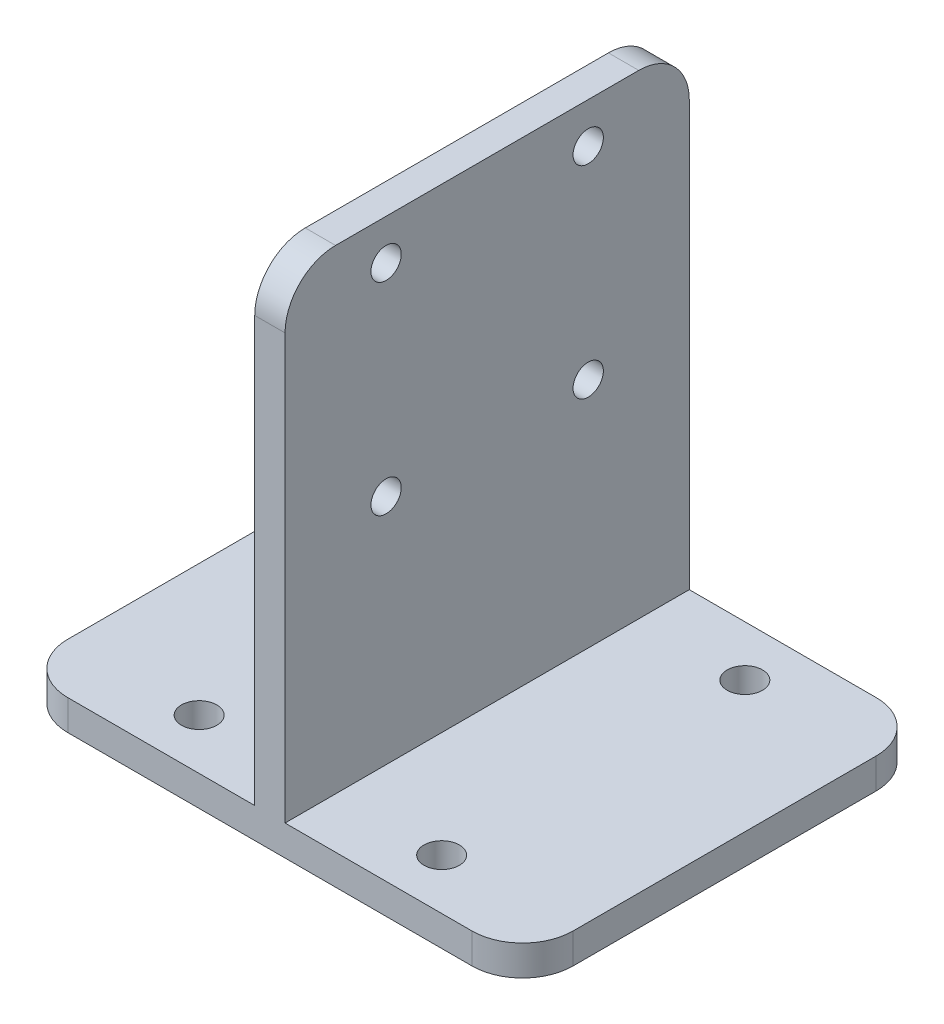
ISO-10303-21;
HEADER;
FILE_DESCRIPTION(('STEP AP214'),'2;1');
FILE_NAME('part.step','',(''),(''),'','','');
FILE_SCHEMA(('AUTOMOTIVE_DESIGN { 1 0 10303 214 1 1 1 1 }'));
ENDSEC;
DATA;
#1=APPLICATION_CONTEXT('core data for automotive mechanical design processes');
#2=APPLICATION_PROTOCOL_DEFINITION('international standard','automotive_design',2000,#1);
#3=PRODUCT_CONTEXT('',#1,'mechanical');
#4=PRODUCT('Part','Part','',(#3));
#5=PRODUCT_RELATED_PRODUCT_CATEGORY('part','',(#4));
#6=PRODUCT_DEFINITION_FORMATION('','',#4);
#7=PRODUCT_DEFINITION_CONTEXT('part definition',#1,'design');
#8=PRODUCT_DEFINITION('design','',#6,#7);
#9=PRODUCT_DEFINITION_SHAPE('','',#8);
#10=(LENGTH_UNIT() NAMED_UNIT(*) SI_UNIT(.MILLI.,.METRE.));
#11=(NAMED_UNIT(*) PLANE_ANGLE_UNIT() SI_UNIT($,.RADIAN.));
#12=(NAMED_UNIT(*) SI_UNIT($,.STERADIAN.) SOLID_ANGLE_UNIT());
#13=UNCERTAINTY_MEASURE_WITH_UNIT(LENGTH_MEASURE(1.E-05),#10,'distance_accuracy_value','');
#14=(GEOMETRIC_REPRESENTATION_CONTEXT(3) GLOBAL_UNCERTAINTY_ASSIGNED_CONTEXT((#13)) GLOBAL_UNIT_ASSIGNED_CONTEXT((#10,
#11,#12)) REPRESENTATION_CONTEXT('',''));
#15=CARTESIAN_POINT('',(0.,0.,0.));
#16=DIRECTION('',(0.,0.,1.));
#17=DIRECTION('',(1.,0.,0.));
#18=AXIS2_PLACEMENT_3D('',#15,#16,#17);
#19=CARTESIAN_POINT('',(0.,3.,0.));
#20=DIRECTION('',(0.,-1.,0.));
#21=DIRECTION('',(0.,0.,-1.));
#22=AXIS2_PLACEMENT_3D('',#19,#20,#21);
#23=PLANE('',#22);
#24=CARTESIAN_POINT('',(12.,3.,15.));
#25=DIRECTION('',(0.,1.,0.));
#26=DIRECTION('',(0.,0.,1.));
#27=AXIS2_PLACEMENT_3D('',#24,#25,#26);
#28=CIRCLE('',#27,1.75);
#29=CARTESIAN_POINT('',(12.,3.,16.75));
#30=VERTEX_POINT('',#29);
#31=EDGE_CURVE('E183',#30,#30,#28,.T.);
#32=ORIENTED_EDGE('',*,*,#31,.F.);
#33=EDGE_LOOP('',(#32));
#34=FACE_BOUND('',#33,.T.);
#35=CARTESIAN_POINT('',(12.,3.,-15.));
#36=DIRECTION('',(0.,1.,0.));
#37=DIRECTION('',(0.,0.,1.));
#38=AXIS2_PLACEMENT_3D('',#35,#36,#37);
#39=CIRCLE('',#38,1.75);
#40=CARTESIAN_POINT('',(12.,3.,-13.25));
#41=VERTEX_POINT('',#40);
#42=EDGE_CURVE('E189',#41,#41,#39,.T.);
#43=ORIENTED_EDGE('',*,*,#42,.F.);
#44=EDGE_LOOP('',(#43));
#45=FACE_BOUND('',#44,.T.);
#46=DIRECTION('',(0.,0.,-1.));
#47=VECTOR('',#46,1.);
#48=CARTESIAN_POINT('',(1.5,3.,20.));
#49=LINE('',#48,#47);
#50=CARTESIAN_POINT('',(1.5,3.,20.));
#51=VERTEX_POINT('',#50);
#52=CARTESIAN_POINT('',(1.5,3.,-20.));
#53=VERTEX_POINT('',#52);
#54=EDGE_CURVE('E162',#51,#53,#49,.T.);
#55=ORIENTED_EDGE('',*,*,#54,.F.);
#56=DIRECTION('',(1.,0.,0.));
#57=VECTOR('',#56,1.);
#58=CARTESIAN_POINT('',(-25.,3.,20.));
#59=LINE('',#58,#57);
#60=CARTESIAN_POINT('',(20.,3.,20.));
#61=VERTEX_POINT('',#60);
#62=EDGE_CURVE('E158',#51,#61,#59,.T.);
#63=ORIENTED_EDGE('',*,*,#62,.T.);
#64=CARTESIAN_POINT('',(20.,3.,15.));
#65=DIRECTION('',(0.,-1.,0.));
#66=DIRECTION('',(0.,0.,-1.));
#67=AXIS2_PLACEMENT_3D('',#64,#65,#66);
#68=CIRCLE('',#67,5.);
#69=CARTESIAN_POINT('',(25.,3.,15.));
#70=VERTEX_POINT('',#69);
#71=EDGE_CURVE('E240',#61,#70,#68,.F.);
#72=ORIENTED_EDGE('',*,*,#71,.T.);
#73=DIRECTION('',(0.,0.,-1.));
#74=VECTOR('',#73,1.);
#75=CARTESIAN_POINT('',(25.,3.,20.));
#76=LINE('',#75,#74);
#77=CARTESIAN_POINT('',(25.,3.,-15.));
#78=VERTEX_POINT('',#77);
#79=EDGE_CURVE('E201',#70,#78,#76,.T.);
#80=ORIENTED_EDGE('',*,*,#79,.T.);
#81=CARTESIAN_POINT('',(20.,3.,-15.));
#82=DIRECTION('',(0.,-1.,0.));
#83=DIRECTION('',(0.,0.,-1.));
#84=AXIS2_PLACEMENT_3D('',#81,#82,#83);
#85=CIRCLE('',#84,5.);
#86=CARTESIAN_POINT('',(20.,3.,-20.));
#87=VERTEX_POINT('',#86);
#88=EDGE_CURVE('E242',#78,#87,#85,.F.);
#89=ORIENTED_EDGE('',*,*,#88,.T.);
#90=DIRECTION('',(-1.,0.,0.));
#91=VECTOR('',#90,1.);
#92=CARTESIAN_POINT('',(-25.,3.,-20.));
#93=LINE('',#92,#91);
#94=EDGE_CURVE('E206',#87,#53,#93,.T.);
#95=ORIENTED_EDGE('',*,*,#94,.T.);
#96=EDGE_LOOP('',(#55,#63,#72,#80,#89,#95));
#97=FACE_BOUND('',#96,.T.);
#98=ADVANCED_FACE('F39',(#34,#45,#97),#23,.F.);
#99=CARTESIAN_POINT('',(-12.,3.,15.));
#100=DIRECTION('',(0.,1.,0.));
#101=DIRECTION('',(0.,0.,1.));
#102=AXIS2_PLACEMENT_3D('',#99,#100,#101);
#103=CIRCLE('',#102,1.75);
#104=CARTESIAN_POINT('',(-12.,3.,16.75));
#105=VERTEX_POINT('',#104);
#106=EDGE_CURVE('E177',#105,#105,#103,.T.);
#107=ORIENTED_EDGE('',*,*,#106,.F.);
#108=EDGE_LOOP('',(#107));
#109=FACE_BOUND('',#108,.T.);
#110=CARTESIAN_POINT('',(-12.,3.,-15.));
#111=DIRECTION('',(0.,1.,0.));
#112=DIRECTION('',(0.,0.,1.));
#113=AXIS2_PLACEMENT_3D('',#110,#111,#112);
#114=CIRCLE('',#113,1.75);
#115=CARTESIAN_POINT('',(-12.,3.,-13.25));
#116=VERTEX_POINT('',#115);
#117=EDGE_CURVE('E195',#116,#116,#114,.T.);
#118=ORIENTED_EDGE('',*,*,#117,.F.);
#119=EDGE_LOOP('',(#118));
#120=FACE_BOUND('',#119,.T.);
#121=DIRECTION('',(0.,0.,1.));
#122=VECTOR('',#121,1.);
#123=CARTESIAN_POINT('',(-1.5,3.,20.));
#124=LINE('',#123,#122);
#125=CARTESIAN_POINT('',(-1.5,3.,-20.));
#126=VERTEX_POINT('',#125);
#127=CARTESIAN_POINT('',(-1.5,3.,20.));
#128=VERTEX_POINT('',#127);
#129=EDGE_CURVE('E152',#126,#128,#124,.T.);
#130=ORIENTED_EDGE('',*,*,#129,.F.);
#131=CARTESIAN_POINT('',(-20.,3.,-20.));
#132=VERTEX_POINT('',#131);
#133=EDGE_CURVE('E204',#126,#132,#93,.T.);
#134=ORIENTED_EDGE('',*,*,#133,.T.);
#135=CARTESIAN_POINT('',(-20.,3.,-15.));
#136=DIRECTION('',(0.,-1.,0.));
#137=DIRECTION('',(0.,0.,-1.));
#138=AXIS2_PLACEMENT_3D('',#135,#136,#137);
#139=CIRCLE('',#138,5.);
#140=CARTESIAN_POINT('',(-25.,3.,-15.));
#141=VERTEX_POINT('',#140);
#142=EDGE_CURVE('E244',#132,#141,#139,.F.);
#143=ORIENTED_EDGE('',*,*,#142,.T.);
#144=DIRECTION('',(0.,0.,1.));
#145=VECTOR('',#144,1.);
#146=CARTESIAN_POINT('',(-25.,3.,20.));
#147=LINE('',#146,#145);
#148=CARTESIAN_POINT('',(-25.,3.,15.));
#149=VERTEX_POINT('',#148);
#150=EDGE_CURVE('E209',#141,#149,#147,.T.);
#151=ORIENTED_EDGE('',*,*,#150,.T.);
#152=CARTESIAN_POINT('',(-20.,3.,15.));
#153=DIRECTION('',(0.,-1.,0.));
#154=DIRECTION('',(0.,0.,-1.));
#155=AXIS2_PLACEMENT_3D('',#152,#153,#154);
#156=CIRCLE('',#155,5.);
#157=CARTESIAN_POINT('',(-20.,3.,20.));
#158=VERTEX_POINT('',#157);
#159=EDGE_CURVE('E156',#149,#158,#156,.F.);
#160=ORIENTED_EDGE('',*,*,#159,.T.);
#161=EDGE_CURVE('E142',#158,#128,#59,.T.);
#162=ORIENTED_EDGE('',*,*,#161,.T.);
#163=EDGE_LOOP('',(#130,#134,#143,#151,#160,#162));
#164=FACE_BOUND('',#163,.T.);
#165=ADVANCED_FACE('F151',(#109,#120,#164),#23,.F.);
#166=CARTESIAN_POINT('',(0.,0.,0.));
#167=DIRECTION('',(0.,-1.,0.));
#168=DIRECTION('',(0.,0.,-1.));
#169=AXIS2_PLACEMENT_3D('',#166,#167,#168);
#170=PLANE('',#169);
#171=CARTESIAN_POINT('',(12.,0.,15.));
#172=DIRECTION('',(0.,1.,0.));
#173=DIRECTION('',(0.,0.,1.));
#174=AXIS2_PLACEMENT_3D('',#171,#172,#173);
#175=CIRCLE('',#174,1.75);
#176=CARTESIAN_POINT('',(12.,0.,16.75));
#177=VERTEX_POINT('',#176);
#178=EDGE_CURVE('E180',#177,#177,#175,.T.);
#179=ORIENTED_EDGE('',*,*,#178,.T.);
#180=EDGE_LOOP('',(#179));
#181=FACE_BOUND('',#180,.T.);
#182=CARTESIAN_POINT('',(-12.,0.,-15.));
#183=DIRECTION('',(0.,1.,0.));
#184=DIRECTION('',(0.,0.,1.));
#185=AXIS2_PLACEMENT_3D('',#182,#183,#184);
#186=CIRCLE('',#185,1.75);
#187=CARTESIAN_POINT('',(-12.,0.,-13.25));
#188=VERTEX_POINT('',#187);
#189=EDGE_CURVE('E192',#188,#188,#186,.T.);
#190=ORIENTED_EDGE('',*,*,#189,.T.);
#191=EDGE_LOOP('',(#190));
#192=FACE_BOUND('',#191,.T.);
#193=DIRECTION('',(0.,0.,1.));
#194=VECTOR('',#193,1.);
#195=CARTESIAN_POINT('',(-25.,0.,20.));
#196=LINE('',#195,#194);
#197=CARTESIAN_POINT('',(-25.,0.,-15.));
#198=VERTEX_POINT('',#197);
#199=CARTESIAN_POINT('',(-25.,0.,15.));
#200=VERTEX_POINT('',#199);
#201=EDGE_CURVE('E216',#198,#200,#196,.T.);
#202=ORIENTED_EDGE('',*,*,#201,.F.);
#203=CARTESIAN_POINT('',(-20.,0.,-15.));
#204=DIRECTION('',(0.,-1.,0.));
#205=DIRECTION('',(0.,0.,-1.));
#206=AXIS2_PLACEMENT_3D('',#203,#204,#205);
#207=CIRCLE('',#206,5.);
#208=CARTESIAN_POINT('',(-20.,0.,-20.));
#209=VERTEX_POINT('',#208);
#210=EDGE_CURVE('E231',#198,#209,#207,.T.);
#211=ORIENTED_EDGE('',*,*,#210,.T.);
#212=DIRECTION('',(-1.,0.,0.));
#213=VECTOR('',#212,1.);
#214=CARTESIAN_POINT('',(-25.,0.,-20.));
#215=LINE('',#214,#213);
#216=CARTESIAN_POINT('',(20.,0.,-20.));
#217=VERTEX_POINT('',#216);
#218=EDGE_CURVE('E213',#217,#209,#215,.T.);
#219=ORIENTED_EDGE('',*,*,#218,.F.);
#220=CARTESIAN_POINT('',(20.,0.,-15.));
#221=DIRECTION('',(0.,-1.,0.));
#222=DIRECTION('',(0.,0.,-1.));
#223=AXIS2_PLACEMENT_3D('',#220,#221,#222);
#224=CIRCLE('',#223,5.);
#225=CARTESIAN_POINT('',(25.,0.,-15.));
#226=VERTEX_POINT('',#225);
#227=EDGE_CURVE('E229',#217,#226,#224,.T.);
#228=ORIENTED_EDGE('',*,*,#227,.T.);
#229=DIRECTION('',(0.,0.,-1.));
#230=VECTOR('',#229,1.);
#231=CARTESIAN_POINT('',(25.,0.,20.));
#232=LINE('',#231,#230);
#233=CARTESIAN_POINT('',(25.,0.,15.));
#234=VERTEX_POINT('',#233);
#235=EDGE_CURVE('E198',#234,#226,#232,.T.);
#236=ORIENTED_EDGE('',*,*,#235,.F.);
#237=CARTESIAN_POINT('',(20.,0.,15.));
#238=DIRECTION('',(0.,-1.,0.));
#239=DIRECTION('',(0.,0.,-1.));
#240=AXIS2_PLACEMENT_3D('',#237,#238,#239);
#241=CIRCLE('',#240,5.);
#242=CARTESIAN_POINT('',(20.,0.,20.));
#243=VERTEX_POINT('',#242);
#244=EDGE_CURVE('E227',#234,#243,#241,.T.);
#245=ORIENTED_EDGE('',*,*,#244,.T.);
#246=DIRECTION('',(1.,0.,0.));
#247=VECTOR('',#246,1.);
#248=CARTESIAN_POINT('',(-25.,0.,20.));
#249=LINE('',#248,#247);
#250=CARTESIAN_POINT('',(-20.,0.,20.));
#251=VERTEX_POINT('',#250);
#252=EDGE_CURVE('E205',#251,#243,#249,.T.);
#253=ORIENTED_EDGE('',*,*,#252,.F.);
#254=CARTESIAN_POINT('',(-20.,0.,15.));
#255=DIRECTION('',(0.,-1.,0.));
#256=DIRECTION('',(0.,0.,-1.));
#257=AXIS2_PLACEMENT_3D('',#254,#255,#256);
#258=CIRCLE('',#257,5.);
#259=EDGE_CURVE('E225',#251,#200,#258,.T.);
#260=ORIENTED_EDGE('',*,*,#259,.T.);
#261=EDGE_LOOP('',(#202,#211,#219,#228,#236,#245,#253,#260));
#262=FACE_BOUND('',#261,.T.);
#263=CARTESIAN_POINT('',(12.,0.,-15.));
#264=DIRECTION('',(0.,1.,0.));
#265=DIRECTION('',(0.,0.,1.));
#266=AXIS2_PLACEMENT_3D('',#263,#264,#265);
#267=CIRCLE('',#266,1.75);
#268=CARTESIAN_POINT('',(12.,0.,-13.25));
#269=VERTEX_POINT('',#268);
#270=EDGE_CURVE('E186',#269,#269,#267,.T.);
#271=ORIENTED_EDGE('',*,*,#270,.T.);
#272=EDGE_LOOP('',(#271));
#273=FACE_BOUND('',#272,.T.);
#274=CARTESIAN_POINT('',(-12.,0.,15.));
#275=DIRECTION('',(0.,1.,0.));
#276=DIRECTION('',(0.,0.,1.));
#277=AXIS2_PLACEMENT_3D('',#274,#275,#276);
#278=CIRCLE('',#277,1.75);
#279=CARTESIAN_POINT('',(-12.,0.,16.75));
#280=VERTEX_POINT('',#279);
#281=EDGE_CURVE('E176',#280,#280,#278,.T.);
#282=ORIENTED_EDGE('',*,*,#281,.T.);
#283=EDGE_LOOP('',(#282));
#284=FACE_BOUND('',#283,.T.);
#285=ADVANCED_FACE('F302',(#181,#192,#262,#273,#284),#170,.T.);
#286=CARTESIAN_POINT('',(25.,3.,20.));
#287=DIRECTION('',(-1.,0.,0.));
#288=DIRECTION('',(0.,0.,1.));
#289=AXIS2_PLACEMENT_3D('',#286,#287,#288);
#290=PLANE('',#289);
#291=ORIENTED_EDGE('',*,*,#235,.T.);
#292=DIRECTION('',(0.,-1.,0.));
#293=VECTOR('',#292,1.);
#294=CARTESIAN_POINT('',(25.,3.,-15.));
#295=LINE('',#294,#293);
#296=EDGE_CURVE('E249',#226,#78,#295,.F.);
#297=ORIENTED_EDGE('',*,*,#296,.T.);
#298=ORIENTED_EDGE('',*,*,#79,.F.);
#299=DIRECTION('',(0.,-1.,0.));
#300=VECTOR('',#299,1.);
#301=CARTESIAN_POINT('',(25.,3.,15.));
#302=LINE('',#301,#300);
#303=EDGE_CURVE('E246',#70,#234,#302,.T.);
#304=ORIENTED_EDGE('',*,*,#303,.T.);
#305=EDGE_LOOP('',(#291,#297,#298,#304));
#306=FACE_BOUND('',#305,.T.);
#307=ADVANCED_FACE('F311',(#306),#290,.F.);
#308=CARTESIAN_POINT('',(-25.,3.,-20.));
#309=DIRECTION('',(0.,0.,1.));
#310=DIRECTION('',(1.,0.,0.));
#311=AXIS2_PLACEMENT_3D('',#308,#309,#310);
#312=PLANE('',#311);
#313=DIRECTION('',(0.,-1.,0.));
#314=VECTOR('',#313,1.);
#315=CARTESIAN_POINT('',(-1.5,50.,-20.));
#316=LINE('',#315,#314);
#317=CARTESIAN_POINT('',(-1.5,45.,-20.));
#318=VERTEX_POINT('',#317);
#319=EDGE_CURVE('E146',#318,#126,#316,.T.);
#320=ORIENTED_EDGE('',*,*,#319,.F.);
#321=DIRECTION('',(-1.,0.,0.));
#322=VECTOR('',#321,1.);
#323=CARTESIAN_POINT('',(-25.,45.,-20.));
#324=LINE('',#323,#322);
#325=CARTESIAN_POINT('',(1.5,45.,-20.));
#326=VERTEX_POINT('',#325);
#327=EDGE_CURVE('E11',#318,#326,#324,.F.);
#328=ORIENTED_EDGE('',*,*,#327,.T.);
#329=DIRECTION('',(0.,-1.,0.));
#330=VECTOR('',#329,1.);
#331=CARTESIAN_POINT('',(1.5,50.,-20.));
#332=LINE('',#331,#330);
#333=EDGE_CURVE('E174',#326,#53,#332,.T.);
#334=ORIENTED_EDGE('',*,*,#333,.T.);
#335=ORIENTED_EDGE('',*,*,#94,.F.);
#336=DIRECTION('',(0.,-1.,0.));
#337=VECTOR('',#336,1.);
#338=CARTESIAN_POINT('',(20.,3.,-20.));
#339=LINE('',#338,#337);
#340=EDGE_CURVE('E233',#87,#217,#339,.T.);
#341=ORIENTED_EDGE('',*,*,#340,.T.);
#342=ORIENTED_EDGE('',*,*,#218,.T.);
#343=DIRECTION('',(0.,-1.,0.));
#344=VECTOR('',#343,1.);
#345=CARTESIAN_POINT('',(-20.,3.,-20.));
#346=LINE('',#345,#344);
#347=EDGE_CURVE('E236',#209,#132,#346,.F.);
#348=ORIENTED_EDGE('',*,*,#347,.T.);
#349=ORIENTED_EDGE('',*,*,#133,.F.);
#350=EDGE_LOOP('',(#320,#328,#334,#335,#341,#342,#348,#349));
#351=FACE_BOUND('',#350,.T.);
#352=ADVANCED_FACE('F289',(#351),#312,.F.);
#353=CARTESIAN_POINT('',(-25.,3.,20.));
#354=DIRECTION('',(1.,0.,0.));
#355=DIRECTION('',(0.,0.,-1.));
#356=AXIS2_PLACEMENT_3D('',#353,#354,#355);
#357=PLANE('',#356);
#358=ORIENTED_EDGE('',*,*,#150,.F.);
#359=DIRECTION('',(0.,-1.,0.));
#360=VECTOR('',#359,1.);
#361=CARTESIAN_POINT('',(-25.,3.,-15.));
#362=LINE('',#361,#360);
#363=EDGE_CURVE('E222',#141,#198,#362,.T.);
#364=ORIENTED_EDGE('',*,*,#363,.T.);
#365=ORIENTED_EDGE('',*,*,#201,.T.);
#366=DIRECTION('',(0.,-1.,0.));
#367=VECTOR('',#366,1.);
#368=CARTESIAN_POINT('',(-25.,3.,15.));
#369=LINE('',#368,#367);
#370=EDGE_CURVE('E157',#200,#149,#369,.F.);
#371=ORIENTED_EDGE('',*,*,#370,.T.);
#372=EDGE_LOOP('',(#358,#364,#365,#371));
#373=FACE_BOUND('',#372,.T.);
#374=ADVANCED_FACE('F296',(#373),#357,.F.);
#375=CARTESIAN_POINT('',(-25.,3.,20.));
#376=DIRECTION('',(0.,0.,-1.));
#377=DIRECTION('',(-1.,0.,0.));
#378=AXIS2_PLACEMENT_3D('',#375,#376,#377);
#379=PLANE('',#378);
#380=DIRECTION('',(0.,-1.,0.));
#381=VECTOR('',#380,1.);
#382=CARTESIAN_POINT('',(1.5,50.,20.));
#383=LINE('',#382,#381);
#384=CARTESIAN_POINT('',(1.5,45.,20.));
#385=VERTEX_POINT('',#384);
#386=EDGE_CURVE('E147',#385,#51,#383,.T.);
#387=ORIENTED_EDGE('',*,*,#386,.F.);
#388=DIRECTION('',(1.,0.,0.));
#389=VECTOR('',#388,1.);
#390=CARTESIAN_POINT('',(-25.,45.,20.));
#391=LINE('',#390,#389);
#392=CARTESIAN_POINT('',(-1.5,45.,20.));
#393=VERTEX_POINT('',#392);
#394=EDGE_CURVE('E62',#385,#393,#391,.F.);
#395=ORIENTED_EDGE('',*,*,#394,.T.);
#396=DIRECTION('',(0.,-1.,0.));
#397=VECTOR('',#396,1.);
#398=CARTESIAN_POINT('',(-1.5,50.,20.));
#399=LINE('',#398,#397);
#400=EDGE_CURVE('E138',#393,#128,#399,.T.);
#401=ORIENTED_EDGE('',*,*,#400,.T.);
#402=ORIENTED_EDGE('',*,*,#161,.F.);
#403=DIRECTION('',(0.,-1.,0.));
#404=VECTOR('',#403,1.);
#405=CARTESIAN_POINT('',(-20.,3.,20.));
#406=LINE('',#405,#404);
#407=EDGE_CURVE('E251',#158,#251,#406,.T.);
#408=ORIENTED_EDGE('',*,*,#407,.T.);
#409=ORIENTED_EDGE('',*,*,#252,.T.);
#410=DIRECTION('',(0.,-1.,0.));
#411=VECTOR('',#410,1.);
#412=CARTESIAN_POINT('',(20.,3.,20.));
#413=LINE('',#412,#411);
#414=EDGE_CURVE('E253',#243,#61,#413,.F.);
#415=ORIENTED_EDGE('',*,*,#414,.T.);
#416=ORIENTED_EDGE('',*,*,#62,.F.);
#417=EDGE_LOOP('',(#387,#395,#401,#402,#408,#409,#415,#416));
#418=FACE_BOUND('',#417,.T.);
#419=ADVANCED_FACE('F140',(#418),#379,.F.);
#420=CARTESIAN_POINT('',(-12.,3.,-15.));
#421=DIRECTION('',(0.,-1.,0.));
#422=DIRECTION('',(0.,0.,-1.));
#423=AXIS2_PLACEMENT_3D('',#420,#421,#422);
#424=CYLINDRICAL_SURFACE('',#423,1.75);
#425=ORIENTED_EDGE('',*,*,#117,.T.);
#426=EDGE_LOOP('',(#425));
#427=FACE_BOUND('',#426,.T.);
#428=ORIENTED_EDGE('',*,*,#189,.F.);
#429=EDGE_LOOP('',(#428));
#430=FACE_BOUND('',#429,.T.);
#431=ADVANCED_FACE('F338',(#427,#430),#424,.F.);
#432=CARTESIAN_POINT('',(12.,3.,-15.));
#433=DIRECTION('',(0.,-1.,0.));
#434=DIRECTION('',(0.,0.,-1.));
#435=AXIS2_PLACEMENT_3D('',#432,#433,#434);
#436=CYLINDRICAL_SURFACE('',#435,1.75);
#437=ORIENTED_EDGE('',*,*,#42,.T.);
#438=EDGE_LOOP('',(#437));
#439=FACE_BOUND('',#438,.T.);
#440=ORIENTED_EDGE('',*,*,#270,.F.);
#441=EDGE_LOOP('',(#440));
#442=FACE_BOUND('',#441,.T.);
#443=ADVANCED_FACE('F499',(#439,#442),#436,.F.);
#444=CARTESIAN_POINT('',(12.,3.,15.));
#445=DIRECTION('',(0.,-1.,0.));
#446=DIRECTION('',(0.,0.,-1.));
#447=AXIS2_PLACEMENT_3D('',#444,#445,#446);
#448=CYLINDRICAL_SURFACE('',#447,1.75);
#449=ORIENTED_EDGE('',*,*,#31,.T.);
#450=EDGE_LOOP('',(#449));
#451=FACE_BOUND('',#450,.T.);
#452=ORIENTED_EDGE('',*,*,#178,.F.);
#453=EDGE_LOOP('',(#452));
#454=FACE_BOUND('',#453,.T.);
#455=ADVANCED_FACE('F496',(#451,#454),#448,.F.);
#456=CARTESIAN_POINT('',(-12.,3.,15.));
#457=DIRECTION('',(0.,-1.,0.));
#458=DIRECTION('',(0.,0.,-1.));
#459=AXIS2_PLACEMENT_3D('',#456,#457,#458);
#460=CYLINDRICAL_SURFACE('',#459,1.75);
#461=ORIENTED_EDGE('',*,*,#106,.T.);
#462=EDGE_LOOP('',(#461));
#463=FACE_BOUND('',#462,.T.);
#464=ORIENTED_EDGE('',*,*,#281,.F.);
#465=EDGE_LOOP('',(#464));
#466=FACE_BOUND('',#465,.T.);
#467=ADVANCED_FACE('F353',(#463,#466),#460,.F.);
#468=CARTESIAN_POINT('',(-20.,3.,-15.));
#469=DIRECTION('',(0.,-1.,0.));
#470=DIRECTION('',(0.,0.,-1.));
#471=AXIS2_PLACEMENT_3D('',#468,#469,#470);
#472=CYLINDRICAL_SURFACE('',#471,5.);
#473=ORIENTED_EDGE('',*,*,#142,.F.);
#474=ORIENTED_EDGE('',*,*,#347,.F.);
#475=ORIENTED_EDGE('',*,*,#210,.F.);
#476=ORIENTED_EDGE('',*,*,#363,.F.);
#477=EDGE_LOOP('',(#473,#474,#475,#476));
#478=FACE_BOUND('',#477,.T.);
#479=ADVANCED_FACE('F299',(#478),#472,.T.);
#480=CARTESIAN_POINT('',(20.,3.,-15.));
#481=DIRECTION('',(0.,-1.,0.));
#482=DIRECTION('',(0.,0.,-1.));
#483=AXIS2_PLACEMENT_3D('',#480,#481,#482);
#484=CYLINDRICAL_SURFACE('',#483,5.);
#485=ORIENTED_EDGE('',*,*,#88,.F.);
#486=ORIENTED_EDGE('',*,*,#296,.F.);
#487=ORIENTED_EDGE('',*,*,#227,.F.);
#488=ORIENTED_EDGE('',*,*,#340,.F.);
#489=EDGE_LOOP('',(#485,#486,#487,#488));
#490=FACE_BOUND('',#489,.T.);
#491=ADVANCED_FACE('F307',(#490),#484,.T.);
#492=CARTESIAN_POINT('',(20.,3.,15.));
#493=DIRECTION('',(0.,-1.,0.));
#494=DIRECTION('',(0.,0.,-1.));
#495=AXIS2_PLACEMENT_3D('',#492,#493,#494);
#496=CYLINDRICAL_SURFACE('',#495,5.);
#497=ORIENTED_EDGE('',*,*,#71,.F.);
#498=ORIENTED_EDGE('',*,*,#414,.F.);
#499=ORIENTED_EDGE('',*,*,#244,.F.);
#500=ORIENTED_EDGE('',*,*,#303,.F.);
#501=EDGE_LOOP('',(#497,#498,#499,#500));
#502=FACE_BOUND('',#501,.T.);
#503=ADVANCED_FACE('F314',(#502),#496,.T.);
#504=CARTESIAN_POINT('',(-20.,3.,15.));
#505=DIRECTION('',(0.,-1.,0.));
#506=DIRECTION('',(0.,0.,-1.));
#507=AXIS2_PLACEMENT_3D('',#504,#505,#506);
#508=CYLINDRICAL_SURFACE('',#507,5.);
#509=ORIENTED_EDGE('',*,*,#159,.F.);
#510=ORIENTED_EDGE('',*,*,#370,.F.);
#511=ORIENTED_EDGE('',*,*,#259,.F.);
#512=ORIENTED_EDGE('',*,*,#407,.F.);
#513=EDGE_LOOP('',(#509,#510,#511,#512));
#514=FACE_BOUND('',#513,.T.);
#515=ADVANCED_FACE('F317',(#514),#508,.T.);
#516=CARTESIAN_POINT('',(1.5,50.,20.));
#517=DIRECTION('',(-1.,0.,0.));
#518=DIRECTION('',(0.,0.,1.));
#519=AXIS2_PLACEMENT_3D('',#516,#517,#518);
#520=PLANE('',#519);
#521=CARTESIAN_POINT('',(1.5,26.,-10.));
#522=DIRECTION('',(-1.,0.,0.));
#523=DIRECTION('',(0.,0.,1.));
#524=AXIS2_PLACEMENT_3D('',#521,#522,#523);
#525=CIRCLE('',#524,1.5);
#526=CARTESIAN_POINT('',(1.5,26.,-8.5));
#527=VERTEX_POINT('',#526);
#528=EDGE_CURVE('E617',#527,#527,#525,.F.);
#529=ORIENTED_EDGE('',*,*,#528,.F.);
#530=EDGE_LOOP('',(#529));
#531=FACE_BOUND('',#530,.T.);
#532=CARTESIAN_POINT('',(1.5,26.,10.));
#533=DIRECTION('',(-1.,0.,0.));
#534=DIRECTION('',(0.,0.,1.));
#535=AXIS2_PLACEMENT_3D('',#532,#533,#534);
#536=CIRCLE('',#535,1.5);
#537=CARTESIAN_POINT('',(1.5,26.,11.5));
#538=VERTEX_POINT('',#537);
#539=EDGE_CURVE('E616',#538,#538,#536,.F.);
#540=ORIENTED_EDGE('',*,*,#539,.F.);
#541=EDGE_LOOP('',(#540));
#542=FACE_BOUND('',#541,.T.);
#543=CARTESIAN_POINT('',(1.5,46.,10.));
#544=DIRECTION('',(-1.,0.,0.));
#545=DIRECTION('',(0.,0.,1.));
#546=AXIS2_PLACEMENT_3D('',#543,#544,#545);
#547=CIRCLE('',#546,1.5);
#548=CARTESIAN_POINT('',(1.5,46.,11.5));
#549=VERTEX_POINT('',#548);
#550=EDGE_CURVE('E612',#549,#549,#547,.F.);
#551=ORIENTED_EDGE('',*,*,#550,.F.);
#552=EDGE_LOOP('',(#551));
#553=FACE_BOUND('',#552,.T.);
#554=CARTESIAN_POINT('',(1.5,46.,-10.));
#555=DIRECTION('',(-1.,0.,0.));
#556=DIRECTION('',(0.,0.,1.));
#557=AXIS2_PLACEMENT_3D('',#554,#555,#556);
#558=CIRCLE('',#557,1.5);
#559=CARTESIAN_POINT('',(1.5,46.,-8.5));
#560=VERTEX_POINT('',#559);
#561=EDGE_CURVE('E168',#560,#560,#558,.F.);
#562=ORIENTED_EDGE('',*,*,#561,.F.);
#563=EDGE_LOOP('',(#562));
#564=FACE_BOUND('',#563,.T.);
#565=DIRECTION('',(0.,0.,-1.));
#566=VECTOR('',#565,1.);
#567=CARTESIAN_POINT('',(1.5,50.,20.));
#568=LINE('',#567,#566);
#569=CARTESIAN_POINT('',(1.5,50.,15.));
#570=VERTEX_POINT('',#569);
#571=CARTESIAN_POINT('',(1.5,50.,-15.));
#572=VERTEX_POINT('',#571);
#573=EDGE_CURVE('E161',#570,#572,#568,.T.);
#574=ORIENTED_EDGE('',*,*,#573,.F.);
#575=CARTESIAN_POINT('',(1.5,45.,15.));
#576=DIRECTION('',(-1.,0.,0.));
#577=DIRECTION('',(0.,0.,1.));
#578=AXIS2_PLACEMENT_3D('',#575,#576,#577);
#579=CIRCLE('',#578,5.);
#580=EDGE_CURVE('E264',#570,#385,#579,.F.);
#581=ORIENTED_EDGE('',*,*,#580,.T.);
#582=ORIENTED_EDGE('',*,*,#386,.T.);
#583=ORIENTED_EDGE('',*,*,#54,.T.);
#584=ORIENTED_EDGE('',*,*,#333,.F.);
#585=CARTESIAN_POINT('',(1.5,45.,-15.));
#586=DIRECTION('',(-1.,0.,0.));
#587=DIRECTION('',(0.,0.,1.));
#588=AXIS2_PLACEMENT_3D('',#585,#586,#587);
#589=CIRCLE('',#588,5.);
#590=EDGE_CURVE('E262',#326,#572,#589,.F.);
#591=ORIENTED_EDGE('',*,*,#590,.T.);
#592=EDGE_LOOP('',(#574,#581,#582,#583,#584,#591));
#593=FACE_BOUND('',#592,.T.);
#594=ADVANCED_FACE('F276',(#531,#542,#553,#564,#593),#520,.F.);
#595=CARTESIAN_POINT('',(-1.5,50.,20.));
#596=DIRECTION('',(1.,0.,0.));
#597=DIRECTION('',(0.,0.,-1.));
#598=AXIS2_PLACEMENT_3D('',#595,#596,#597);
#599=PLANE('',#598);
#600=CARTESIAN_POINT('',(-1.5,26.,-10.));
#601=DIRECTION('',(-1.,0.,0.));
#602=DIRECTION('',(0.,0.,1.));
#603=AXIS2_PLACEMENT_3D('',#600,#601,#602);
#604=CIRCLE('',#603,1.5);
#605=CARTESIAN_POINT('',(-1.5,26.,-8.5));
#606=VERTEX_POINT('',#605);
#607=EDGE_CURVE('E597',#606,#606,#604,.T.);
#608=ORIENTED_EDGE('',*,*,#607,.F.);
#609=EDGE_LOOP('',(#608));
#610=FACE_BOUND('',#609,.T.);
#611=CARTESIAN_POINT('',(-1.5,26.,10.));
#612=DIRECTION('',(-1.,0.,0.));
#613=DIRECTION('',(0.,0.,1.));
#614=AXIS2_PLACEMENT_3D('',#611,#612,#613);
#615=CIRCLE('',#614,1.5);
#616=CARTESIAN_POINT('',(-1.5,26.,11.5));
#617=VERTEX_POINT('',#616);
#618=EDGE_CURVE('E601',#617,#617,#615,.T.);
#619=ORIENTED_EDGE('',*,*,#618,.F.);
#620=EDGE_LOOP('',(#619));
#621=FACE_BOUND('',#620,.T.);
#622=CARTESIAN_POINT('',(-1.5,46.,10.));
#623=DIRECTION('',(-1.,0.,0.));
#624=DIRECTION('',(0.,0.,1.));
#625=AXIS2_PLACEMENT_3D('',#622,#623,#624);
#626=CIRCLE('',#625,1.5);
#627=CARTESIAN_POINT('',(-1.5,46.,11.5));
#628=VERTEX_POINT('',#627);
#629=EDGE_CURVE('E605',#628,#628,#626,.T.);
#630=ORIENTED_EDGE('',*,*,#629,.F.);
#631=EDGE_LOOP('',(#630));
#632=FACE_BOUND('',#631,.T.);
#633=CARTESIAN_POINT('',(-1.5,46.,-10.));
#634=DIRECTION('',(-1.,0.,0.));
#635=DIRECTION('',(0.,0.,1.));
#636=AXIS2_PLACEMENT_3D('',#633,#634,#635);
#637=CIRCLE('',#636,1.5);
#638=CARTESIAN_POINT('',(-1.5,46.,-8.5));
#639=VERTEX_POINT('',#638);
#640=EDGE_CURVE('E608',#639,#639,#637,.T.);
#641=ORIENTED_EDGE('',*,*,#640,.F.);
#642=EDGE_LOOP('',(#641));
#643=FACE_BOUND('',#642,.T.);
#644=ORIENTED_EDGE('',*,*,#400,.F.);
#645=CARTESIAN_POINT('',(-1.5,45.,15.));
#646=DIRECTION('',(1.,0.,0.));
#647=DIRECTION('',(0.,0.,-1.));
#648=AXIS2_PLACEMENT_3D('',#645,#646,#647);
#649=CIRCLE('',#648,5.);
#650=CARTESIAN_POINT('',(-1.5,50.,15.));
#651=VERTEX_POINT('',#650);
#652=EDGE_CURVE('E47',#393,#651,#649,.F.);
#653=ORIENTED_EDGE('',*,*,#652,.T.);
#654=DIRECTION('',(0.,0.,1.));
#655=VECTOR('',#654,1.);
#656=CARTESIAN_POINT('',(-1.5,50.,20.));
#657=LINE('',#656,#655);
#658=CARTESIAN_POINT('',(-1.5,50.,-15.));
#659=VERTEX_POINT('',#658);
#660=EDGE_CURVE('E165',#659,#651,#657,.T.);
#661=ORIENTED_EDGE('',*,*,#660,.F.);
#662=CARTESIAN_POINT('',(-1.5,45.,-15.));
#663=DIRECTION('',(1.,0.,0.));
#664=DIRECTION('',(0.,0.,-1.));
#665=AXIS2_PLACEMENT_3D('',#662,#663,#664);
#666=CIRCLE('',#665,5.);
#667=EDGE_CURVE('E54',#659,#318,#666,.F.);
#668=ORIENTED_EDGE('',*,*,#667,.T.);
#669=ORIENTED_EDGE('',*,*,#319,.T.);
#670=ORIENTED_EDGE('',*,*,#129,.T.);
#671=EDGE_LOOP('',(#644,#653,#661,#668,#669,#670));
#672=FACE_BOUND('',#671,.T.);
#673=ADVANCED_FACE('F160',(#610,#621,#632,#643,#672),#599,.F.);
#674=CARTESIAN_POINT('',(0.,50.,0.));
#675=DIRECTION('',(0.,-1.,0.));
#676=DIRECTION('',(0.,0.,-1.));
#677=AXIS2_PLACEMENT_3D('',#674,#675,#676);
#678=PLANE('',#677);
#679=ORIENTED_EDGE('',*,*,#660,.T.);
#680=DIRECTION('',(1.,0.,0.));
#681=VECTOR('',#680,1.);
#682=CARTESIAN_POINT('',(0.,50.,15.));
#683=LINE('',#682,#681);
#684=EDGE_CURVE('E259',#651,#570,#683,.T.);
#685=ORIENTED_EDGE('',*,*,#684,.T.);
#686=ORIENTED_EDGE('',*,*,#573,.T.);
#687=DIRECTION('',(-1.,0.,0.));
#688=VECTOR('',#687,1.);
#689=CARTESIAN_POINT('',(0.,50.,-15.));
#690=LINE('',#689,#688);
#691=EDGE_CURVE('E256',#572,#659,#690,.T.);
#692=ORIENTED_EDGE('',*,*,#691,.T.);
#693=EDGE_LOOP('',(#679,#685,#686,#692));
#694=FACE_BOUND('',#693,.T.);
#695=ADVANCED_FACE('F271',(#694),#678,.F.);
#696=CARTESIAN_POINT('',(25.001,46.,-10.));
#697=DIRECTION('',(-1.,0.,0.));
#698=DIRECTION('',(0.,0.,1.));
#699=AXIS2_PLACEMENT_3D('',#696,#697,#698);
#700=CYLINDRICAL_SURFACE('',#699,1.5);
#701=ORIENTED_EDGE('',*,*,#640,.T.);
#702=EDGE_LOOP('',(#701));
#703=FACE_BOUND('',#702,.T.);
#704=ORIENTED_EDGE('',*,*,#561,.T.);
#705=EDGE_LOOP('',(#704));
#706=FACE_BOUND('',#705,.T.);
#707=ADVANCED_FACE('F386',(#703,#706),#700,.F.);
#708=CARTESIAN_POINT('',(25.001,46.,10.));
#709=DIRECTION('',(-1.,0.,0.));
#710=DIRECTION('',(0.,0.,1.));
#711=AXIS2_PLACEMENT_3D('',#708,#709,#710);
#712=CYLINDRICAL_SURFACE('',#711,1.5);
#713=ORIENTED_EDGE('',*,*,#629,.T.);
#714=EDGE_LOOP('',(#713));
#715=FACE_BOUND('',#714,.T.);
#716=ORIENTED_EDGE('',*,*,#550,.T.);
#717=EDGE_LOOP('',(#716));
#718=FACE_BOUND('',#717,.T.);
#719=ADVANCED_FACE('F391',(#715,#718),#712,.F.);
#720=CARTESIAN_POINT('',(25.001,26.,10.));
#721=DIRECTION('',(-1.,0.,0.));
#722=DIRECTION('',(0.,0.,1.));
#723=AXIS2_PLACEMENT_3D('',#720,#721,#722);
#724=CYLINDRICAL_SURFACE('',#723,1.5);
#725=ORIENTED_EDGE('',*,*,#618,.T.);
#726=EDGE_LOOP('',(#725));
#727=FACE_BOUND('',#726,.T.);
#728=ORIENTED_EDGE('',*,*,#539,.T.);
#729=EDGE_LOOP('',(#728));
#730=FACE_BOUND('',#729,.T.);
#731=ADVANCED_FACE('F404',(#727,#730),#724,.F.);
#732=CARTESIAN_POINT('',(25.001,26.,-10.));
#733=DIRECTION('',(-1.,0.,0.));
#734=DIRECTION('',(0.,0.,1.));
#735=AXIS2_PLACEMENT_3D('',#732,#733,#734);
#736=CYLINDRICAL_SURFACE('',#735,1.5);
#737=ORIENTED_EDGE('',*,*,#607,.T.);
#738=EDGE_LOOP('',(#737));
#739=FACE_BOUND('',#738,.T.);
#740=ORIENTED_EDGE('',*,*,#528,.T.);
#741=EDGE_LOOP('',(#740));
#742=FACE_BOUND('',#741,.T.);
#743=ADVANCED_FACE('F415',(#739,#742),#736,.F.);
#744=CARTESIAN_POINT('',(0.,45.,15.));
#745=DIRECTION('',(1.,0.,0.));
#746=DIRECTION('',(0.,0.,-1.));
#747=AXIS2_PLACEMENT_3D('',#744,#745,#746);
#748=CYLINDRICAL_SURFACE('',#747,5.);
#749=ORIENTED_EDGE('',*,*,#652,.F.);
#750=ORIENTED_EDGE('',*,*,#394,.F.);
#751=ORIENTED_EDGE('',*,*,#580,.F.);
#752=ORIENTED_EDGE('',*,*,#684,.F.);
#753=EDGE_LOOP('',(#749,#750,#751,#752));
#754=FACE_BOUND('',#753,.T.);
#755=ADVANCED_FACE('F274',(#754),#748,.T.);
#756=CARTESIAN_POINT('',(0.,45.,-15.));
#757=DIRECTION('',(-1.,0.,0.));
#758=DIRECTION('',(0.,0.,1.));
#759=AXIS2_PLACEMENT_3D('',#756,#757,#758);
#760=CYLINDRICAL_SURFACE('',#759,5.);
#761=ORIENTED_EDGE('',*,*,#590,.F.);
#762=ORIENTED_EDGE('',*,*,#327,.F.);
#763=ORIENTED_EDGE('',*,*,#667,.F.);
#764=ORIENTED_EDGE('',*,*,#691,.F.);
#765=EDGE_LOOP('',(#761,#762,#763,#764));
#766=FACE_BOUND('',#765,.T.);
#767=ADVANCED_FACE('F41',(#766),#760,.T.);
#768=CLOSED_SHELL('',(#98,#165,#285,#307,#352,#374,#419,#431,#443,#455,#467,#479,#491,#503,#515,
#594,#673,#695,#707,#719,#731,#743,#755,#767));
#769=MANIFOLD_SOLID_BREP('B2',#768);
#770=ADVANCED_BREP_SHAPE_REPRESENTATION('',(#18,#769),#14);
#771=SHAPE_DEFINITION_REPRESENTATION(#9,#770);
ENDSEC;
END-ISO-10303-21;
